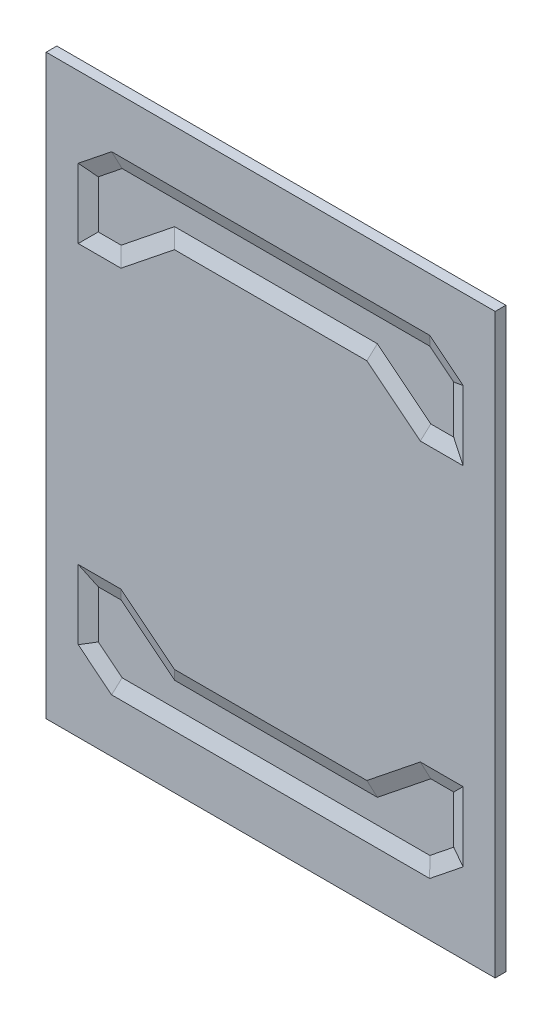
ISO-10303-21;
HEADER;
FILE_DESCRIPTION(('STEP AP214'),'2;1');
FILE_NAME('part.step','',(''),(''),'','','');
FILE_SCHEMA(('AUTOMOTIVE_DESIGN { 1 0 10303 214 1 1 1 1 }'));
ENDSEC;
DATA;
#1=APPLICATION_CONTEXT('core data for automotive mechanical design processes');
#2=APPLICATION_PROTOCOL_DEFINITION('international standard','automotive_design',2000,#1);
#3=PRODUCT_CONTEXT('',#1,'mechanical');
#4=PRODUCT('Part','Part','',(#3));
#5=PRODUCT_RELATED_PRODUCT_CATEGORY('part','',(#4));
#6=PRODUCT_DEFINITION_FORMATION('','',#4);
#7=PRODUCT_DEFINITION_CONTEXT('part definition',#1,'design');
#8=PRODUCT_DEFINITION('design','',#6,#7);
#9=PRODUCT_DEFINITION_SHAPE('','',#8);
#10=(LENGTH_UNIT() NAMED_UNIT(*) SI_UNIT(.MILLI.,.METRE.));
#11=(NAMED_UNIT(*) PLANE_ANGLE_UNIT() SI_UNIT($,.RADIAN.));
#12=(NAMED_UNIT(*) SI_UNIT($,.STERADIAN.) SOLID_ANGLE_UNIT());
#13=UNCERTAINTY_MEASURE_WITH_UNIT(LENGTH_MEASURE(1.E-05),#10,'distance_accuracy_value','');
#14=(GEOMETRIC_REPRESENTATION_CONTEXT(3) GLOBAL_UNCERTAINTY_ASSIGNED_CONTEXT((#13)) GLOBAL_UNIT_ASSIGNED_CONTEXT((#10,
#11,#12)) REPRESENTATION_CONTEXT('',''));
#15=CARTESIAN_POINT('',(0.,0.,0.));
#16=DIRECTION('',(0.,0.,1.));
#17=DIRECTION('',(1.,0.,0.));
#18=AXIS2_PLACEMENT_3D('',#15,#16,#17);
#19=CARTESIAN_POINT('',(0.,0.,10.));
#20=DIRECTION('',(1.,0.,0.));
#21=DIRECTION('',(0.,0.,-1.));
#22=AXIS2_PLACEMENT_3D('',#19,#20,#21);
#23=PLANE('',#22);
#24=DIRECTION('',(0.,-1.,0.));
#25=VECTOR('',#24,1.);
#26=CARTESIAN_POINT('',(0.,0.,0.));
#27=LINE('',#26,#25);
#28=CARTESIAN_POINT('',(0.,540.,0.));
#29=VERTEX_POINT('',#28);
#30=CARTESIAN_POINT('',(0.,0.,0.));
#31=VERTEX_POINT('',#30);
#32=EDGE_CURVE('E274',#29,#31,#27,.T.);
#33=ORIENTED_EDGE('',*,*,#32,.T.);
#34=DIRECTION('',(0.,0.,-1.));
#35=VECTOR('',#34,1.);
#36=CARTESIAN_POINT('',(0.,0.,10.));
#37=LINE('',#36,#35);
#38=CARTESIAN_POINT('',(0.,0.,10.));
#39=VERTEX_POINT('',#38);
#40=EDGE_CURVE('E301',#39,#31,#37,.T.);
#41=ORIENTED_EDGE('',*,*,#40,.F.);
#42=DIRECTION('',(0.,-1.,0.));
#43=VECTOR('',#42,1.);
#44=CARTESIAN_POINT('',(0.,0.,10.));
#45=LINE('',#44,#43);
#46=CARTESIAN_POINT('',(0.,540.,10.));
#47=VERTEX_POINT('',#46);
#48=EDGE_CURVE('E275',#47,#39,#45,.T.);
#49=ORIENTED_EDGE('',*,*,#48,.F.);
#50=DIRECTION('',(0.,0.,-1.));
#51=VECTOR('',#50,1.);
#52=CARTESIAN_POINT('',(0.,540.,10.));
#53=LINE('',#52,#51);
#54=EDGE_CURVE('E285',#47,#29,#53,.T.);
#55=ORIENTED_EDGE('',*,*,#54,.T.);
#56=EDGE_LOOP('',(#33,#41,#49,#55));
#57=FACE_BOUND('',#56,.T.);
#58=ADVANCED_FACE('F33',(#57),#23,.F.);
#59=CARTESIAN_POINT('',(0.,0.,10.));
#60=DIRECTION('',(0.,1.,0.));
#61=DIRECTION('',(0.,0.,1.));
#62=AXIS2_PLACEMENT_3D('',#59,#60,#61);
#63=PLANE('',#62);
#64=DIRECTION('',(1.,0.,0.));
#65=VECTOR('',#64,1.);
#66=CARTESIAN_POINT('',(0.,0.,0.));
#67=LINE('',#66,#65);
#68=CARTESIAN_POINT('',(420.,0.,0.));
#69=VERTEX_POINT('',#68);
#70=EDGE_CURVE('E288',#31,#69,#67,.T.);
#71=ORIENTED_EDGE('',*,*,#70,.T.);
#72=DIRECTION('',(0.,0.,-1.));
#73=VECTOR('',#72,1.);
#74=CARTESIAN_POINT('',(420.,0.,10.));
#75=LINE('',#74,#73);
#76=CARTESIAN_POINT('',(420.,0.,10.));
#77=VERTEX_POINT('',#76);
#78=EDGE_CURVE('E298',#77,#69,#75,.T.);
#79=ORIENTED_EDGE('',*,*,#78,.F.);
#80=DIRECTION('',(1.,0.,0.));
#81=VECTOR('',#80,1.);
#82=CARTESIAN_POINT('',(0.,0.,10.));
#83=LINE('',#82,#81);
#84=EDGE_CURVE('E278',#39,#77,#83,.T.);
#85=ORIENTED_EDGE('',*,*,#84,.F.);
#86=ORIENTED_EDGE('',*,*,#40,.T.);
#87=EDGE_LOOP('',(#71,#79,#85,#86));
#88=FACE_BOUND('',#87,.T.);
#89=ADVANCED_FACE('F429',(#88),#63,.F.);
#90=CARTESIAN_POINT('',(420.,0.,10.));
#91=DIRECTION('',(-1.,0.,0.));
#92=DIRECTION('',(0.,0.,1.));
#93=AXIS2_PLACEMENT_3D('',#90,#91,#92);
#94=PLANE('',#93);
#95=DIRECTION('',(0.,1.,0.));
#96=VECTOR('',#95,1.);
#97=CARTESIAN_POINT('',(420.,0.,0.));
#98=LINE('',#97,#96);
#99=CARTESIAN_POINT('',(420.,540.,0.));
#100=VERTEX_POINT('',#99);
#101=EDGE_CURVE('E290',#69,#100,#98,.T.);
#102=ORIENTED_EDGE('',*,*,#101,.T.);
#103=DIRECTION('',(0.,0.,-1.));
#104=VECTOR('',#103,1.);
#105=CARTESIAN_POINT('',(420.,540.,10.));
#106=LINE('',#105,#104);
#107=CARTESIAN_POINT('',(420.,540.,10.));
#108=VERTEX_POINT('',#107);
#109=EDGE_CURVE('E295',#108,#100,#106,.T.);
#110=ORIENTED_EDGE('',*,*,#109,.F.);
#111=DIRECTION('',(0.,1.,0.));
#112=VECTOR('',#111,1.);
#113=CARTESIAN_POINT('',(420.,0.,10.));
#114=LINE('',#113,#112);
#115=EDGE_CURVE('E281',#77,#108,#114,.T.);
#116=ORIENTED_EDGE('',*,*,#115,.F.);
#117=ORIENTED_EDGE('',*,*,#78,.T.);
#118=EDGE_LOOP('',(#102,#110,#116,#117));
#119=FACE_BOUND('',#118,.T.);
#120=ADVANCED_FACE('F435',(#119),#94,.F.);
#121=CARTESIAN_POINT('',(0.,540.,10.));
#122=DIRECTION('',(0.,-1.,0.));
#123=DIRECTION('',(0.,0.,-1.));
#124=AXIS2_PLACEMENT_3D('',#121,#122,#123);
#125=PLANE('',#124);
#126=DIRECTION('',(-1.,0.,0.));
#127=VECTOR('',#126,1.);
#128=CARTESIAN_POINT('',(0.,540.,0.));
#129=LINE('',#128,#127);
#130=EDGE_CURVE('E279',#100,#29,#129,.T.);
#131=ORIENTED_EDGE('',*,*,#130,.T.);
#132=ORIENTED_EDGE('',*,*,#54,.F.);
#133=DIRECTION('',(-1.,0.,0.));
#134=VECTOR('',#133,1.);
#135=CARTESIAN_POINT('',(0.,540.,10.));
#136=LINE('',#135,#134);
#137=EDGE_CURVE('E283',#108,#47,#136,.T.);
#138=ORIENTED_EDGE('',*,*,#137,.F.);
#139=ORIENTED_EDGE('',*,*,#109,.T.);
#140=EDGE_LOOP('',(#131,#132,#138,#139));
#141=FACE_BOUND('',#140,.T.);
#142=ADVANCED_FACE('F626',(#141),#125,.F.);
#143=CARTESIAN_POINT('',(0.,0.,10.));
#144=DIRECTION('',(0.,0.,-1.));
#145=DIRECTION('',(-1.,0.,0.));
#146=AXIS2_PLACEMENT_3D('',#143,#144,#145);
#147=PLANE('',#146);
#148=DIRECTION('',(1.,0.,0.));
#149=VECTOR('',#148,1.);
#150=CARTESIAN_POINT('',(70.0000000000038,400.,10.));
#151=LINE('',#150,#149);
#152=CARTESIAN_POINT('',(30.0000000000038,400.,10.));
#153=VERTEX_POINT('',#152);
#154=CARTESIAN_POINT('',(70.0000000000038,400.,10.));
#155=VERTEX_POINT('',#154);
#156=EDGE_CURVE('E198',#153,#155,#151,.T.);
#157=ORIENTED_EDGE('',*,*,#156,.F.);
#158=DIRECTION('',(0.,-1.,0.));
#159=VECTOR('',#158,1.);
#160=CARTESIAN_POINT('',(30.0000000000038,400.,10.));
#161=LINE('',#160,#159);
#162=CARTESIAN_POINT('',(30.0000000000038,465.,10.));
#163=VERTEX_POINT('',#162);
#164=EDGE_CURVE('E220',#163,#153,#161,.T.);
#165=ORIENTED_EDGE('',*,*,#164,.F.);
#166=DIRECTION('',(-0.78086880944303,-0.624695047554424,0.));
#167=VECTOR('',#166,1.);
#168=CARTESIAN_POINT('',(30.0000000000038,465.,10.));
#169=LINE('',#168,#167);
#170=CARTESIAN_POINT('',(61.2500000000038,490.,10.));
#171=VERTEX_POINT('',#170);
#172=EDGE_CURVE('E241',#171,#163,#169,.T.);
#173=ORIENTED_EDGE('',*,*,#172,.F.);
#174=DIRECTION('',(-1.,0.,0.));
#175=VECTOR('',#174,1.);
#176=CARTESIAN_POINT('',(61.2500000000038,490.,10.));
#177=LINE('',#176,#175);
#178=CARTESIAN_POINT('',(358.750000000004,490.,10.));
#179=VERTEX_POINT('',#178);
#180=EDGE_CURVE('E238',#179,#171,#177,.T.);
#181=ORIENTED_EDGE('',*,*,#180,.F.);
#182=DIRECTION('',(-0.78086880944303,0.624695047554424,0.));
#183=VECTOR('',#182,1.);
#184=CARTESIAN_POINT('',(390.000000000004,465.,10.));
#185=LINE('',#184,#183);
#186=CARTESIAN_POINT('',(390.000000000004,465.,10.));
#187=VERTEX_POINT('',#186);
#188=EDGE_CURVE('E235',#187,#179,#185,.T.);
#189=ORIENTED_EDGE('',*,*,#188,.F.);
#190=DIRECTION('',(0.,1.,0.));
#191=VECTOR('',#190,1.);
#192=CARTESIAN_POINT('',(390.000000000004,400.,10.));
#193=LINE('',#192,#191);
#194=CARTESIAN_POINT('',(390.000000000004,400.,10.));
#195=VERTEX_POINT('',#194);
#196=EDGE_CURVE('E232',#195,#187,#193,.T.);
#197=ORIENTED_EDGE('',*,*,#196,.F.);
#198=DIRECTION('',(1.,0.,0.));
#199=VECTOR('',#198,1.);
#200=CARTESIAN_POINT('',(350.000000000004,400.,10.));
#201=LINE('',#200,#199);
#202=CARTESIAN_POINT('',(350.000000000004,400.,10.));
#203=VERTEX_POINT('',#202);
#204=EDGE_CURVE('E229',#203,#195,#201,.T.);
#205=ORIENTED_EDGE('',*,*,#204,.F.);
#206=DIRECTION('',(0.780868809443031,-0.624695047554423,0.));
#207=VECTOR('',#206,1.);
#208=CARTESIAN_POINT('',(300.000000000004,440.,10.));
#209=LINE('',#208,#207);
#210=CARTESIAN_POINT('',(300.000000000004,440.,10.));
#211=VERTEX_POINT('',#210);
#212=EDGE_CURVE('E226',#211,#203,#209,.T.);
#213=ORIENTED_EDGE('',*,*,#212,.F.);
#214=DIRECTION('',(1.,0.,0.));
#215=VECTOR('',#214,1.);
#216=CARTESIAN_POINT('',(300.000000000004,440.,10.));
#217=LINE('',#216,#215);
#218=CARTESIAN_POINT('',(120.000000000004,440.,10.));
#219=VERTEX_POINT('',#218);
#220=EDGE_CURVE('E201',#219,#211,#217,.T.);
#221=ORIENTED_EDGE('',*,*,#220,.F.);
#222=DIRECTION('',(0.780868809443031,0.624695047554423,0.));
#223=VECTOR('',#222,1.);
#224=CARTESIAN_POINT('',(120.000000000004,440.,10.));
#225=LINE('',#224,#223);
#226=EDGE_CURVE('E193',#155,#219,#225,.T.);
#227=ORIENTED_EDGE('',*,*,#226,.F.);
#228=EDGE_LOOP('',(#157,#165,#173,#181,#189,#197,#205,#213,#221,#227));
#229=FACE_BOUND('',#228,.T.);
#230=DIRECTION('',(-0.780868809443031,-0.624695047554423,0.));
#231=VECTOR('',#230,1.);
#232=CARTESIAN_POINT('',(300.000000000004,100.,10.));
#233=LINE('',#232,#231);
#234=CARTESIAN_POINT('',(350.000000000004,140.,10.));
#235=VERTEX_POINT('',#234);
#236=CARTESIAN_POINT('',(300.000000000004,100.,10.));
#237=VERTEX_POINT('',#236);
#238=EDGE_CURVE('E247',#235,#237,#233,.T.);
#239=ORIENTED_EDGE('',*,*,#238,.F.);
#240=DIRECTION('',(-1.,0.,0.));
#241=VECTOR('',#240,1.);
#242=CARTESIAN_POINT('',(350.000000000004,140.,10.));
#243=LINE('',#242,#241);
#244=CARTESIAN_POINT('',(390.000000000004,140.,10.));
#245=VERTEX_POINT('',#244);
#246=EDGE_CURVE('E244',#245,#235,#243,.T.);
#247=ORIENTED_EDGE('',*,*,#246,.F.);
#248=DIRECTION('',(0.,1.,0.));
#249=VECTOR('',#248,1.);
#250=CARTESIAN_POINT('',(390.000000000004,140.,10.));
#251=LINE('',#250,#249);
#252=CARTESIAN_POINT('',(390.000000000004,75.0000000000001,10.));
#253=VERTEX_POINT('',#252);
#254=EDGE_CURVE('E271',#253,#245,#251,.T.);
#255=ORIENTED_EDGE('',*,*,#254,.F.);
#256=DIRECTION('',(0.78086880944303,0.624695047554424,0.));
#257=VECTOR('',#256,1.);
#258=CARTESIAN_POINT('',(390.000000000004,75.0000000000001,10.));
#259=LINE('',#258,#257);
#260=CARTESIAN_POINT('',(358.750000000004,50.,10.));
#261=VERTEX_POINT('',#260);
#262=EDGE_CURVE('E268',#261,#253,#259,.T.);
#263=ORIENTED_EDGE('',*,*,#262,.F.);
#264=DIRECTION('',(1.,0.,0.));
#265=VECTOR('',#264,1.);
#266=CARTESIAN_POINT('',(61.2500000000038,50.,10.));
#267=LINE('',#266,#265);
#268=CARTESIAN_POINT('',(61.2500000000038,50.,10.));
#269=VERTEX_POINT('',#268);
#270=EDGE_CURVE('E265',#269,#261,#267,.T.);
#271=ORIENTED_EDGE('',*,*,#270,.F.);
#272=DIRECTION('',(0.78086880944303,-0.624695047554424,0.));
#273=VECTOR('',#272,1.);
#274=CARTESIAN_POINT('',(30.0000000000038,75.0000000000001,10.));
#275=LINE('',#274,#273);
#276=CARTESIAN_POINT('',(30.0000000000038,75.0000000000001,10.));
#277=VERTEX_POINT('',#276);
#278=EDGE_CURVE('E262',#277,#269,#275,.T.);
#279=ORIENTED_EDGE('',*,*,#278,.F.);
#280=DIRECTION('',(0.,-1.,0.));
#281=VECTOR('',#280,1.);
#282=CARTESIAN_POINT('',(30.0000000000038,140.,10.));
#283=LINE('',#282,#281);
#284=CARTESIAN_POINT('',(30.0000000000038,140.,10.));
#285=VERTEX_POINT('',#284);
#286=EDGE_CURVE('E259',#285,#277,#283,.T.);
#287=ORIENTED_EDGE('',*,*,#286,.F.);
#288=DIRECTION('',(-1.,0.,0.));
#289=VECTOR('',#288,1.);
#290=CARTESIAN_POINT('',(70.0000000000038,140.,10.));
#291=LINE('',#290,#289);
#292=CARTESIAN_POINT('',(70.0000000000038,140.,10.));
#293=VERTEX_POINT('',#292);
#294=EDGE_CURVE('E256',#293,#285,#291,.T.);
#295=ORIENTED_EDGE('',*,*,#294,.F.);
#296=DIRECTION('',(-0.780868809443031,0.624695047554423,0.));
#297=VECTOR('',#296,1.);
#298=CARTESIAN_POINT('',(120.000000000004,100.,10.));
#299=LINE('',#298,#297);
#300=CARTESIAN_POINT('',(120.000000000004,100.,10.));
#301=VERTEX_POINT('',#300);
#302=EDGE_CURVE('E253',#301,#293,#299,.T.);
#303=ORIENTED_EDGE('',*,*,#302,.F.);
#304=DIRECTION('',(-1.,0.,0.));
#305=VECTOR('',#304,1.);
#306=CARTESIAN_POINT('',(300.000000000004,100.,10.));
#307=LINE('',#306,#305);
#308=EDGE_CURVE('E250',#237,#301,#307,.T.);
#309=ORIENTED_EDGE('',*,*,#308,.F.);
#310=EDGE_LOOP('',(#239,#247,#255,#263,#271,#279,#287,#295,#303,#309));
#311=FACE_BOUND('',#310,.T.);
#312=ORIENTED_EDGE('',*,*,#48,.T.);
#313=ORIENTED_EDGE('',*,*,#84,.T.);
#314=ORIENTED_EDGE('',*,*,#115,.T.);
#315=ORIENTED_EDGE('',*,*,#137,.T.);
#316=EDGE_LOOP('',(#312,#313,#314,#315));
#317=FACE_BOUND('',#316,.T.);
#318=ADVANCED_FACE('F195',(#229,#311,#317),#147,.F.);
#319=CARTESIAN_POINT('',(0.,0.,0.));
#320=DIRECTION('',(0.,0.,-1.));
#321=DIRECTION('',(-1.,0.,0.));
#322=AXIS2_PLACEMENT_3D('',#319,#320,#321);
#323=PLANE('',#322);
#324=ORIENTED_EDGE('',*,*,#32,.F.);
#325=ORIENTED_EDGE('',*,*,#130,.F.);
#326=ORIENTED_EDGE('',*,*,#101,.F.);
#327=ORIENTED_EDGE('',*,*,#70,.F.);
#328=EDGE_LOOP('',(#324,#325,#326,#327));
#329=FACE_BOUND('',#328,.T.);
#330=ADVANCED_FACE('F609',(#329),#323,.T.);
#331=CARTESIAN_POINT('',(0.,0.,5.));
#332=DIRECTION('',(0.,0.,-1.));
#333=DIRECTION('',(-1.,0.,0.));
#334=AXIS2_PLACEMENT_3D('',#331,#332,#333);
#335=PLANE('',#334);
#336=DIRECTION('',(0.780868809443031,0.624695047554424,0.));
#337=VECTOR('',#336,1.);
#338=CARTESIAN_POINT('',(381.418322313999,85.727097107506,5.));
#339=LINE('',#338,#337);
#340=CARTESIAN_POINT('',(353.931184801208,63.7373870972735,5.));
#341=VERTEX_POINT('',#340);
#342=CARTESIAN_POINT('',(376.26261290273,81.6025295784911,5.));
#343=VERTEX_POINT('',#342);
#344=EDGE_CURVE('E42',#341,#343,#339,.T.);
#345=ORIENTED_EDGE('',*,*,#344,.T.);
#346=DIRECTION('',(0.,1.,0.));
#347=VECTOR('',#346,1.);
#348=CARTESIAN_POINT('',(376.26261290273,140.,5.));
#349=LINE('',#348,#347);
#350=CARTESIAN_POINT('',(376.26261290273,126.262612902727,5.));
#351=VERTEX_POINT('',#350);
#352=EDGE_CURVE('E11',#343,#351,#349,.T.);
#353=ORIENTED_EDGE('',*,*,#352,.T.);
#354=DIRECTION('',(-1.,0.,0.));
#355=VECTOR('',#354,1.);
#356=CARTESIAN_POINT('',(350.000000000004,126.262612902727,5.));
#357=LINE('',#356,#355);
#358=CARTESIAN_POINT('',(354.818815198799,126.262612902727,5.));
#359=VERTEX_POINT('',#358);
#360=EDGE_CURVE('E324',#351,#359,#357,.T.);
#361=ORIENTED_EDGE('',*,*,#360,.T.);
#362=DIRECTION('',(-0.780868809443031,-0.624695047554423,0.));
#363=VECTOR('',#362,1.);
#364=CARTESIAN_POINT('',(308.581677686008,89.2729028924941,5.));
#365=LINE('',#364,#363);
#366=CARTESIAN_POINT('',(304.818815198799,86.2626129027266,5.));
#367=VERTEX_POINT('',#366);
#368=EDGE_CURVE('E326',#359,#367,#365,.T.);
#369=ORIENTED_EDGE('',*,*,#368,.T.);
#370=DIRECTION('',(-1.,0.,0.));
#371=VECTOR('',#370,1.);
#372=CARTESIAN_POINT('',(120.000000000004,86.2626129027266,5.));
#373=LINE('',#372,#371);
#374=CARTESIAN_POINT('',(115.181184801208,86.2626129027266,5.));
#375=VERTEX_POINT('',#374);
#376=EDGE_CURVE('E328',#367,#375,#373,.T.);
#377=ORIENTED_EDGE('',*,*,#376,.T.);
#378=DIRECTION('',(-0.780868809443031,0.624695047554423,0.));
#379=VECTOR('',#378,1.);
#380=CARTESIAN_POINT('',(61.418322313999,129.272902892494,5.));
#381=LINE('',#380,#379);
#382=CARTESIAN_POINT('',(65.1811848012084,126.262612902727,5.));
#383=VERTEX_POINT('',#382);
#384=EDGE_CURVE('E330',#375,#383,#381,.T.);
#385=ORIENTED_EDGE('',*,*,#384,.T.);
#386=DIRECTION('',(-1.,0.,0.));
#387=VECTOR('',#386,1.);
#388=CARTESIAN_POINT('',(30.0000000000038,126.262612902727,5.));
#389=LINE('',#388,#387);
#390=CARTESIAN_POINT('',(43.7373870972772,126.262612902727,5.));
#391=VERTEX_POINT('',#390);
#392=EDGE_CURVE('E332',#383,#391,#389,.T.);
#393=ORIENTED_EDGE('',*,*,#392,.T.);
#394=DIRECTION('',(0.,-1.,0.));
#395=VECTOR('',#394,1.);
#396=CARTESIAN_POINT('',(43.7373870972772,75.0000000000001,5.));
#397=LINE('',#396,#395);
#398=CARTESIAN_POINT('',(43.7373870972772,81.6025295784911,5.));
#399=VERTEX_POINT('',#398);
#400=EDGE_CURVE('E334',#391,#399,#397,.T.);
#401=ORIENTED_EDGE('',*,*,#400,.T.);
#402=DIRECTION('',(0.78086880944303,-0.624695047554424,0.));
#403=VECTOR('',#402,1.);
#404=CARTESIAN_POINT('',(69.8316776860086,60.727097107506,5.));
#405=LINE('',#404,#403);
#406=CARTESIAN_POINT('',(66.0688151987992,63.7373870972735,5.));
#407=VERTEX_POINT('',#406);
#408=EDGE_CURVE('E336',#399,#407,#405,.T.);
#409=ORIENTED_EDGE('',*,*,#408,.T.);
#410=DIRECTION('',(1.,0.,0.));
#411=VECTOR('',#410,1.);
#412=CARTESIAN_POINT('',(358.750000000004,63.7373870972735,5.));
#413=LINE('',#412,#411);
#414=EDGE_CURVE('E53',#407,#341,#413,.T.);
#415=ORIENTED_EDGE('',*,*,#414,.T.);
#416=EDGE_LOOP('',(#345,#353,#361,#369,#377,#385,#393,#401,#409,#415));
#417=FACE_BOUND('',#416,.T.);
#418=ADVANCED_FACE('F409',(#417),#335,.F.);
#419=CARTESIAN_POINT('',(0.,0.,5.));
#420=DIRECTION('',(0.,0.,-1.));
#421=DIRECTION('',(-1.,0.,0.));
#422=AXIS2_PLACEMENT_3D('',#419,#420,#421);
#423=PLANE('',#422);
#424=DIRECTION('',(-1.,0.,0.));
#425=VECTOR('',#424,1.);
#426=CARTESIAN_POINT('',(61.2500000000038,476.262612902727,5.));
#427=LINE('',#426,#425);
#428=CARTESIAN_POINT('',(353.931184801208,476.262612902727,5.));
#429=VERTEX_POINT('',#428);
#430=CARTESIAN_POINT('',(66.0688151987991,476.262612902727,5.));
#431=VERTEX_POINT('',#430);
#432=EDGE_CURVE('E319',#429,#431,#427,.T.);
#433=ORIENTED_EDGE('',*,*,#432,.T.);
#434=DIRECTION('',(-0.78086880944303,-0.624695047554424,0.));
#435=VECTOR('',#434,1.);
#436=CARTESIAN_POINT('',(38.5816776860085,454.272902892494,5.));
#437=LINE('',#436,#435);
#438=CARTESIAN_POINT('',(43.7373870972771,458.397470421509,5.));
#439=VERTEX_POINT('',#438);
#440=EDGE_CURVE('E321',#431,#439,#437,.T.);
#441=ORIENTED_EDGE('',*,*,#440,.T.);
#442=DIRECTION('',(0.,-1.,0.));
#443=VECTOR('',#442,1.);
#444=CARTESIAN_POINT('',(43.7373870972771,400.,5.));
#445=LINE('',#444,#443);
#446=CARTESIAN_POINT('',(43.7373870972771,413.737387097273,5.));
#447=VERTEX_POINT('',#446);
#448=EDGE_CURVE('E304',#439,#447,#445,.T.);
#449=ORIENTED_EDGE('',*,*,#448,.T.);
#450=DIRECTION('',(1.,0.,0.));
#451=VECTOR('',#450,1.);
#452=CARTESIAN_POINT('',(70.0000000000038,413.737387097273,5.));
#453=LINE('',#452,#451);
#454=CARTESIAN_POINT('',(65.1811848012083,413.737387097273,5.));
#455=VERTEX_POINT('',#454);
#456=EDGE_CURVE('E306',#447,#455,#453,.T.);
#457=ORIENTED_EDGE('',*,*,#456,.T.);
#458=DIRECTION('',(0.780868809443031,0.624695047554423,0.));
#459=VECTOR('',#458,1.);
#460=CARTESIAN_POINT('',(111.418322313999,450.727097107506,5.));
#461=LINE('',#460,#459);
#462=CARTESIAN_POINT('',(115.181184801208,453.737387097273,5.));
#463=VERTEX_POINT('',#462);
#464=EDGE_CURVE('E210',#455,#463,#461,.T.);
#465=ORIENTED_EDGE('',*,*,#464,.T.);
#466=DIRECTION('',(1.,0.,0.));
#467=VECTOR('',#466,1.);
#468=CARTESIAN_POINT('',(300.000000000004,453.737387097273,5.));
#469=LINE('',#468,#467);
#470=CARTESIAN_POINT('',(304.818815198799,453.737387097273,5.));
#471=VERTEX_POINT('',#470);
#472=EDGE_CURVE('E309',#463,#471,#469,.T.);
#473=ORIENTED_EDGE('',*,*,#472,.T.);
#474=DIRECTION('',(0.780868809443031,-0.624695047554423,0.));
#475=VECTOR('',#474,1.);
#476=CARTESIAN_POINT('',(358.581677686008,410.727097107506,5.));
#477=LINE('',#476,#475);
#478=CARTESIAN_POINT('',(354.818815198799,413.737387097273,5.));
#479=VERTEX_POINT('',#478);
#480=EDGE_CURVE('E311',#471,#479,#477,.T.);
#481=ORIENTED_EDGE('',*,*,#480,.T.);
#482=DIRECTION('',(1.,0.,0.));
#483=VECTOR('',#482,1.);
#484=CARTESIAN_POINT('',(390.000000000004,413.737387097273,5.));
#485=LINE('',#484,#483);
#486=CARTESIAN_POINT('',(376.26261290273,413.737387097273,5.));
#487=VERTEX_POINT('',#486);
#488=EDGE_CURVE('E313',#479,#487,#485,.T.);
#489=ORIENTED_EDGE('',*,*,#488,.T.);
#490=DIRECTION('',(0.,1.,0.));
#491=VECTOR('',#490,1.);
#492=CARTESIAN_POINT('',(376.26261290273,465.,5.));
#493=LINE('',#492,#491);
#494=CARTESIAN_POINT('',(376.26261290273,458.397470421509,5.));
#495=VERTEX_POINT('',#494);
#496=EDGE_CURVE('E315',#487,#495,#493,.T.);
#497=ORIENTED_EDGE('',*,*,#496,.T.);
#498=DIRECTION('',(-0.780868809443031,0.624695047554424,0.));
#499=VECTOR('',#498,1.);
#500=CARTESIAN_POINT('',(350.168322313999,479.272902892494,5.));
#501=LINE('',#500,#499);
#502=EDGE_CURVE('E317',#495,#429,#501,.T.);
#503=ORIENTED_EDGE('',*,*,#502,.T.);
#504=EDGE_LOOP('',(#433,#441,#449,#457,#465,#473,#481,#489,#497,#503));
#505=FACE_BOUND('',#504,.T.);
#506=ADVANCED_FACE('F475',(#505),#423,.F.);
#507=CARTESIAN_POINT('',(340.288994759176,425.361243448972,5.));
#508=DIRECTION('',(0.213658289699396,0.267072862124246,0.93969262078591));
#509=DIRECTION('',(-0.780868809443031,0.624695047554423,0.));
#510=AXIS2_PLACEMENT_3D('',#507,#508,#509);
#511=PLANE('',#510);
#512=DIRECTION('',(0.313057437902422,0.892458214463441,-0.32482822539105));
#513=VECTOR('',#512,1.);
#514=CARTESIAN_POINT('',(274.945059582951,368.573850415716,35.9969923969243));
#515=LINE('',#514,#513);
#516=EDGE_CURVE('E354',#211,#471,#515,.T.);
#517=ORIENTED_EDGE('',*,*,#516,.F.);
#518=ORIENTED_EDGE('',*,*,#212,.T.);
#519=DIRECTION('',(0.313057437902422,0.892458214463441,-0.32482822539105));
#520=VECTOR('',#519,1.);
#521=CARTESIAN_POINT('',(320.044811611649,314.604316312971,41.0814869968899));
#522=LINE('',#521,#520);
#523=EDGE_CURVE('E222',#479,#203,#522,.F.);
#524=ORIENTED_EDGE('',*,*,#523,.F.);
#525=ORIENTED_EDGE('',*,*,#480,.F.);
#526=EDGE_LOOP('',(#517,#518,#524,#525));
#527=FACE_BOUND('',#526,.T.);
#528=ADVANCED_FACE('F471',(#527),#511,.T.);
#529=CARTESIAN_POINT('',(0.,413.737387097273,5.));
#530=DIRECTION('',(0.,0.342020143325664,0.93969262078591));
#531=DIRECTION('',(-1.,0.,0.));
#532=AXIS2_PLACEMENT_3D('',#529,#530,#531);
#533=PLANE('',#532);
#534=ORIENTED_EDGE('',*,*,#523,.T.);
#535=ORIENTED_EDGE('',*,*,#204,.T.);
#536=DIRECTION('',(-0.684791078771737,0.684791078771737,-0.24924356936395));
#537=VECTOR('',#536,1.);
#538=CARTESIAN_POINT('',(570.280135645657,219.719864354347,75.6166032044899));
#539=LINE('',#538,#537);
#540=EDGE_CURVE('E351',#487,#195,#539,.F.);
#541=ORIENTED_EDGE('',*,*,#540,.F.);
#542=ORIENTED_EDGE('',*,*,#488,.F.);
#543=EDGE_LOOP('',(#534,#535,#541,#542));
#544=FACE_BOUND('',#543,.T.);
#545=ADVANCED_FACE('F467',(#544),#533,.T.);
#546=CARTESIAN_POINT('',(0.,453.737387097273,5.));
#547=DIRECTION('',(0.,0.342020143325664,0.93969262078591));
#548=DIRECTION('',(-1.,0.,0.));
#549=AXIS2_PLACEMENT_3D('',#546,#547,#548);
#550=PLANE('',#549);
#551=ORIENTED_EDGE('',*,*,#516,.T.);
#552=ORIENTED_EDGE('',*,*,#472,.F.);
#553=DIRECTION('',(-0.313057437902432,0.892458214463438,-0.324828225391049));
#554=VECTOR('',#553,1.);
#555=CARTESIAN_POINT('',(151.775148134884,349.416009538785,42.9698762289352));
#556=LINE('',#555,#554);
#557=EDGE_CURVE('E349',#219,#463,#556,.T.);
#558=ORIENTED_EDGE('',*,*,#557,.F.);
#559=ORIENTED_EDGE('',*,*,#220,.T.);
#560=EDGE_LOOP('',(#551,#552,#558,#559));
#561=FACE_BOUND('',#560,.T.);
#562=ADVANCED_FACE('F463',(#561),#550,.T.);
#563=CARTESIAN_POINT('',(376.26261290273,0.,5.));
#564=DIRECTION('',(-0.342020143325664,0.,0.93969262078591));
#565=DIRECTION('',(0.,-1.,0.));
#566=AXIS2_PLACEMENT_3D('',#563,#564,#565);
#567=PLANE('',#566);
#568=ORIENTED_EDGE('',*,*,#540,.T.);
#569=ORIENTED_EDGE('',*,*,#196,.T.);
#570=DIRECTION('',(-0.856399643710187,-0.411606948145765,-0.311703978946684));
#571=VECTOR('',#570,1.);
#572=CARTESIAN_POINT('',(373.635391657227,457.134762611076,4.04376966780512));
#573=LINE('',#572,#571);
#574=EDGE_CURVE('E213',#495,#187,#573,.F.);
#575=ORIENTED_EDGE('',*,*,#574,.F.);
#576=ORIENTED_EDGE('',*,*,#496,.F.);
#577=EDGE_LOOP('',(#568,#569,#575,#576));
#578=FACE_BOUND('',#577,.T.);
#579=ADVANCED_FACE('F460',(#578),#567,.T.);
#580=CARTESIAN_POINT('',(-176.386555734784,220.48319466848,5.));
#581=DIRECTION('',(-0.213658289699395,0.267072862124245,0.939692620785911));
#582=DIRECTION('',(-0.780868809443031,-0.624695047554423,0.));
#583=AXIS2_PLACEMENT_3D('',#580,#581,#582);
#584=PLANE('',#583);
#585=ORIENTED_EDGE('',*,*,#557,.T.);
#586=ORIENTED_EDGE('',*,*,#464,.F.);
#587=DIRECTION('',(-0.313057437902432,0.892458214463438,-0.324828225391049));
#588=VECTOR('',#587,1.);
#589=CARTESIAN_POINT('',(95.4997688239894,327.305742018571,36.4585461073081));
#590=LINE('',#589,#588);
#591=EDGE_CURVE('E208',#155,#455,#590,.T.);
#592=ORIENTED_EDGE('',*,*,#591,.F.);
#593=ORIENTED_EDGE('',*,*,#226,.T.);
#594=EDGE_LOOP('',(#585,#586,#592,#593));
#595=FACE_BOUND('',#594,.T.);
#596=ADVANCED_FACE('F209',(#595),#584,.T.);
#597=CARTESIAN_POINT('',(370.442712557899,463.053390697374,5.));
#598=DIRECTION('',(-0.213658289699396,-0.267072862124245,0.93969262078591));
#599=DIRECTION('',(0.780868809443031,-0.624695047554424,0.));
#600=AXIS2_PLACEMENT_3D('',#597,#598,#599);
#601=PLANE('',#600);
#602=ORIENTED_EDGE('',*,*,#574,.T.);
#603=ORIENTED_EDGE('',*,*,#188,.T.);
#604=DIRECTION('',(-0.313057437902429,-0.892458214463438,-0.324828225391049));
#605=VECTOR('',#604,1.);
#606=CARTESIAN_POINT('',(319.244173395158,377.377537780618,-30.9912239576243));
#607=LINE('',#606,#605);
#608=EDGE_CURVE('E214',#429,#179,#607,.F.);
#609=ORIENTED_EDGE('',*,*,#608,.F.);
#610=ORIENTED_EDGE('',*,*,#502,.F.);
#611=EDGE_LOOP('',(#602,#603,#609,#610));
#612=FACE_BOUND('',#611,.T.);
#613=ADVANCED_FACE('F454',(#612),#601,.T.);
#614=CARTESIAN_POINT('',(0.,413.737387097273,5.));
#615=DIRECTION('',(0.,0.342020143325664,0.93969262078591));
#616=DIRECTION('',(-1.,0.,0.));
#617=AXIS2_PLACEMENT_3D('',#614,#615,#616);
#618=PLANE('',#617);
#619=ORIENTED_EDGE('',*,*,#591,.T.);
#620=ORIENTED_EDGE('',*,*,#456,.F.);
#621=DIRECTION('',(0.684791078771737,0.684791078771736,-0.24924356936395));
#622=VECTOR('',#621,1.);
#623=CARTESIAN_POINT('',(23.227228333532,393.227228333528,12.4650872900772));
#624=LINE('',#623,#622);
#625=EDGE_CURVE('E218',#153,#447,#624,.T.);
#626=ORIENTED_EDGE('',*,*,#625,.F.);
#627=ORIENTED_EDGE('',*,*,#156,.T.);
#628=EDGE_LOOP('',(#619,#620,#626,#627));
#629=FACE_BOUND('',#628,.T.);
#630=ADVANCED_FACE('F216',(#629),#618,.T.);
#631=CARTESIAN_POINT('',(0.,476.262612902727,5.));
#632=DIRECTION('',(0.,-0.342020143325664,0.93969262078591));
#633=DIRECTION('',(1.,0.,0.));
#634=AXIS2_PLACEMENT_3D('',#631,#632,#633);
#635=PLANE('',#634);
#636=ORIENTED_EDGE('',*,*,#608,.T.);
#637=ORIENTED_EDGE('',*,*,#180,.T.);
#638=DIRECTION('',(0.313057437902424,-0.89245821446344,-0.32482822539105));
#639=VECTOR('',#638,1.);
#640=CARTESIAN_POINT('',(100.283323906649,378.724539523143,-30.5009554178406));
#641=LINE('',#640,#639);
#642=EDGE_CURVE('E342',#431,#171,#641,.F.);
#643=ORIENTED_EDGE('',*,*,#642,.F.);
#644=ORIENTED_EDGE('',*,*,#432,.F.);
#645=EDGE_LOOP('',(#636,#637,#643,#644));
#646=FACE_BOUND('',#645,.T.);
#647=ADVANCED_FACE('F447',(#646),#635,.T.);
#648=CARTESIAN_POINT('',(43.7373870972771,0.,5.));
#649=DIRECTION('',(0.342020143325664,0.,0.93969262078591));
#650=DIRECTION('',(0.,1.,0.));
#651=AXIS2_PLACEMENT_3D('',#648,#649,#650);
#652=PLANE('',#651);
#653=ORIENTED_EDGE('',*,*,#625,.T.);
#654=ORIENTED_EDGE('',*,*,#448,.F.);
#655=DIRECTION('',(-0.856399643710188,0.411606948145761,0.311703978946684));
#656=VECTOR('',#655,1.);
#657=CARTESIAN_POINT('',(-69.2430332406666,512.698667715402,46.1215100578947));
#658=LINE('',#657,#656);
#659=EDGE_CURVE('E340',#163,#439,#658,.F.);
#660=ORIENTED_EDGE('',*,*,#659,.F.);
#661=ORIENTED_EDGE('',*,*,#164,.T.);
#662=EDGE_LOOP('',(#653,#654,#660,#661));
#663=FACE_BOUND('',#662,.T.);
#664=ADVANCED_FACE('F443',(#663),#652,.T.);
#665=CARTESIAN_POINT('',(-206.540273533506,258.175341916882,5.));
#666=DIRECTION('',(0.213658289699397,-0.267072862124246,0.93969262078591));
#667=DIRECTION('',(0.78086880944303,0.624695047554424,0.));
#668=AXIS2_PLACEMENT_3D('',#665,#666,#667);
#669=PLANE('',#668);
#670=ORIENTED_EDGE('',*,*,#642,.T.);
#671=ORIENTED_EDGE('',*,*,#172,.T.);
#672=ORIENTED_EDGE('',*,*,#659,.T.);
#673=ORIENTED_EDGE('',*,*,#440,.F.);
#674=EDGE_LOOP('',(#670,#671,#672,#673));
#675=FACE_BOUND('',#674,.T.);
#676=ADVANCED_FACE('F440',(#675),#669,.T.);
#677=CARTESIAN_POINT('',(0.,126.262612902727,5.));
#678=DIRECTION('',(0.,-0.342020143325663,0.93969262078591));
#679=DIRECTION('',(1.,0.,0.));
#680=AXIS2_PLACEMENT_3D('',#677,#678,#679);
#681=PLANE('',#680);
#682=DIRECTION('',(-0.313057437902421,-0.892458214463441,-0.324828225391049));
#683=VECTOR('',#682,1.);
#684=CARTESIAN_POINT('',(58.7931054294255,108.051597223971,-1.62826764282209));
#685=LINE('',#684,#683);
#686=EDGE_CURVE('E380',#293,#383,#685,.T.);
#687=ORIENTED_EDGE('',*,*,#686,.F.);
#688=ORIENTED_EDGE('',*,*,#294,.T.);
#689=DIRECTION('',(0.684791078771737,-0.684791078771737,-0.24924356936395));
#690=VECTOR('',#689,1.);
#691=CARTESIAN_POINT('',(102.946827999645,67.0531720003589,-16.5504740760052));
#692=LINE('',#691,#690);
#693=EDGE_CURVE('E37',#391,#285,#692,.F.);
#694=ORIENTED_EDGE('',*,*,#693,.F.);
#695=ORIENTED_EDGE('',*,*,#392,.F.);
#696=EDGE_LOOP('',(#687,#688,#694,#695));
#697=FACE_BOUND('',#696,.T.);
#698=ADVANCED_FACE('F35',(#697),#681,.T.);
#699=CARTESIAN_POINT('',(43.7373870972772,0.,5.));
#700=DIRECTION('',(0.342020143325663,0.,0.939692620785911));
#701=DIRECTION('',(0.,1.,0.));
#702=AXIS2_PLACEMENT_3D('',#699,#700,#701);
#703=PLANE('',#702);
#704=ORIENTED_EDGE('',*,*,#693,.T.);
#705=ORIENTED_EDGE('',*,*,#286,.T.);
#706=DIRECTION('',(0.856399643710189,0.411606948145761,-0.311703978946684));
#707=VECTOR('',#706,1.);
#708=CARTESIAN_POINT('',(49.6676838165908,84.4527775347613,2.84154851380338));
#709=LINE('',#708,#707);
#710=EDGE_CURVE('E378',#399,#277,#709,.F.);
#711=ORIENTED_EDGE('',*,*,#710,.F.);
#712=ORIENTED_EDGE('',*,*,#400,.F.);
#713=EDGE_LOOP('',(#704,#705,#711,#712));
#714=FACE_BOUND('',#713,.T.);
#715=ADVANCED_FACE('F389',(#714),#703,.T.);
#716=CARTESIAN_POINT('',(87.0280784115576,108.785098014447,5.));
#717=DIRECTION('',(-0.213658289699396,-0.267072862124246,0.93969262078591));
#718=DIRECTION('',(0.780868809443031,-0.624695047554423,0.));
#719=AXIS2_PLACEMENT_3D('',#716,#717,#718);
#720=PLANE('',#719);
#721=ORIENTED_EDGE('',*,*,#686,.T.);
#722=ORIENTED_EDGE('',*,*,#384,.F.);
#723=DIRECTION('',(-0.313057437902421,-0.892458214463441,-0.324828225391049));
#724=VECTOR('',#723,1.);
#725=CARTESIAN_POINT('',(103.892857458124,54.0820631212262,-6.71276224278769));
#726=LINE('',#725,#724);
#727=EDGE_CURVE('E375',#301,#375,#726,.T.);
#728=ORIENTED_EDGE('',*,*,#727,.F.);
#729=ORIENTED_EDGE('',*,*,#302,.T.);
#730=EDGE_LOOP('',(#721,#722,#728,#729));
#731=FACE_BOUND('',#730,.T.);
#732=ADVANCED_FACE('F420',(#731),#720,.T.);
#733=CARTESIAN_POINT('',(56.8743606128356,71.0929507660444,5.));
#734=DIRECTION('',(0.213658289699396,0.267072862124245,0.93969262078591));
#735=DIRECTION('',(-0.78086880944303,0.624695047554424,0.));
#736=AXIS2_PLACEMENT_3D('',#733,#734,#735);
#737=PLANE('',#736);
#738=ORIENTED_EDGE('',*,*,#710,.T.);
#739=ORIENTED_EDGE('',*,*,#278,.T.);
#740=DIRECTION('',(0.313057437902423,0.89245821446344,-0.324828225391049));
#741=VECTOR('',#740,1.);
#742=CARTESIAN_POINT('',(59.593743645915,45.2783757563221,11.7185306820884));
#743=LINE('',#742,#741);
#744=EDGE_CURVE('E372',#407,#269,#743,.F.);
#745=ORIENTED_EDGE('',*,*,#744,.F.);
#746=ORIENTED_EDGE('',*,*,#408,.F.);
#747=EDGE_LOOP('',(#738,#739,#745,#746));
#748=FACE_BOUND('',#747,.T.);
#749=ADVANCED_FACE('F397',(#748),#737,.T.);
#750=CARTESIAN_POINT('',(0.,86.2626129027266,5.));
#751=DIRECTION('',(0.,-0.342020143325663,0.93969262078591));
#752=DIRECTION('',(1.,0.,0.));
#753=AXIS2_PLACEMENT_3D('',#750,#751,#752);
#754=PLANE('',#753);
#755=ORIENTED_EDGE('',*,*,#727,.T.);
#756=ORIENTED_EDGE('',*,*,#376,.F.);
#757=DIRECTION('',(0.313057437902423,-0.89245821446344,-0.324828225391049));
#758=VECTOR('',#757,1.);
#759=CARTESIAN_POINT('',(333.427573485636,4.70530664685409,-24.6844318640698));
#760=LINE('',#759,#758);
#761=EDGE_CURVE('E369',#237,#367,#760,.T.);
#762=ORIENTED_EDGE('',*,*,#761,.F.);
#763=ORIENTED_EDGE('',*,*,#308,.T.);
#764=EDGE_LOOP('',(#755,#756,#762,#763));
#765=FACE_BOUND('',#764,.T.);
#766=ADVANCED_FACE('F419',(#765),#754,.T.);
#767=CARTESIAN_POINT('',(0.,63.7373870972735,5.));
#768=DIRECTION('',(0.,0.342020143325663,0.93969262078591));
#769=DIRECTION('',(-1.,0.,0.));
#770=AXIS2_PLACEMENT_3D('',#767,#768,#769);
#771=PLANE('',#770);
#772=ORIENTED_EDGE('',*,*,#744,.T.);
#773=ORIENTED_EDGE('',*,*,#270,.T.);
#774=DIRECTION('',(-0.313057437902424,0.89245821446344,-0.324828225391049));
#775=VECTOR('',#774,1.);
#776=CARTESIAN_POINT('',(384.919397713871,-24.6032233375065,37.1533526751656));
#777=LINE('',#776,#775);
#778=EDGE_CURVE('E366',#341,#261,#777,.F.);
#779=ORIENTED_EDGE('',*,*,#778,.F.);
#780=ORIENTED_EDGE('',*,*,#414,.F.);
#781=EDGE_LOOP('',(#772,#773,#779,#780));
#782=FACE_BOUND('',#781,.T.);
#783=ADVANCED_FACE('F400',(#782),#771,.T.);
#784=CARTESIAN_POINT('',(76.8743606128351,-96.0929507660441,5.));
#785=DIRECTION('',(0.213658289699396,-0.267072862124245,0.93969262078591));
#786=DIRECTION('',(0.780868809443031,0.624695047554423,0.));
#787=AXIS2_PLACEMENT_3D('',#784,#785,#786);
#788=PLANE('',#787);
#789=ORIENTED_EDGE('',*,*,#761,.T.);
#790=ORIENTED_EDGE('',*,*,#368,.F.);
#791=DIRECTION('',(0.313057437902423,-0.89245821446344,-0.324828225391049));
#792=VECTOR('',#791,1.);
#793=CARTESIAN_POINT('',(389.70295279653,26.815574167068,-31.1957619856971));
#794=LINE('',#793,#792);
#795=EDGE_CURVE('E363',#235,#359,#794,.T.);
#796=ORIENTED_EDGE('',*,*,#795,.F.);
#797=ORIENTED_EDGE('',*,*,#238,.T.);
#798=EDGE_LOOP('',(#789,#790,#796,#797));
#799=FACE_BOUND('',#798,.T.);
#800=ADVANCED_FACE('F415',(#799),#788,.T.);
#801=CARTESIAN_POINT('',(107.028078411558,-133.785098014447,5.));
#802=DIRECTION('',(-0.213658289699396,0.267072862124245,0.93969262078591));
#803=DIRECTION('',(-0.780868809443031,-0.624695047554424,0.));
#804=AXIS2_PLACEMENT_3D('',#801,#802,#803);
#805=PLANE('',#804);
#806=ORIENTED_EDGE('',*,*,#778,.T.);
#807=ORIENTED_EDGE('',*,*,#262,.T.);
#808=DIRECTION('',(-0.856399643710188,0.411606948145762,-0.311703978946684));
#809=VECTOR('',#808,1.);
#810=CARTESIAN_POINT('',(405.027508148498,67.7774061880271,15.4695656612445));
#811=LINE('',#810,#809);
#812=EDGE_CURVE('E361',#343,#253,#811,.F.);
#813=ORIENTED_EDGE('',*,*,#812,.F.);
#814=ORIENTED_EDGE('',*,*,#344,.F.);
#815=EDGE_LOOP('',(#806,#807,#813,#814));
#816=FACE_BOUND('',#815,.T.);
#817=ADVANCED_FACE('F402',(#816),#805,.T.);
#818=CARTESIAN_POINT('',(0.,126.262612902727,5.));
#819=DIRECTION('',(0.,-0.342020143325663,0.93969262078591));
#820=DIRECTION('',(1.,0.,0.));
#821=AXIS2_PLACEMENT_3D('',#818,#819,#820);
#822=PLANE('',#821);
#823=ORIENTED_EDGE('',*,*,#795,.T.);
#824=ORIENTED_EDGE('',*,*,#360,.F.);
#825=DIRECTION('',(0.684791078771737,0.684791078771737,0.24924356936395));
#826=VECTOR('',#825,1.);
#827=CARTESIAN_POINT('',(317.053172000363,67.0531720003589,-16.5504740760052));
#828=LINE('',#827,#826);
#829=EDGE_CURVE('E359',#245,#351,#828,.F.);
#830=ORIENTED_EDGE('',*,*,#829,.F.);
#831=ORIENTED_EDGE('',*,*,#246,.T.);
#832=EDGE_LOOP('',(#823,#824,#830,#831));
#833=FACE_BOUND('',#832,.T.);
#834=ADVANCED_FACE('F417',(#833),#822,.T.);
#835=CARTESIAN_POINT('',(376.26261290273,0.,5.));
#836=DIRECTION('',(-0.342020143325663,0.,0.93969262078591));
#837=DIRECTION('',(0.,-1.,0.));
#838=AXIS2_PLACEMENT_3D('',#835,#836,#837);
#839=PLANE('',#838);
#840=ORIENTED_EDGE('',*,*,#812,.T.);
#841=ORIENTED_EDGE('',*,*,#254,.T.);
#842=ORIENTED_EDGE('',*,*,#829,.T.);
#843=ORIENTED_EDGE('',*,*,#352,.F.);
#844=EDGE_LOOP('',(#840,#841,#842,#843));
#845=FACE_BOUND('',#844,.T.);
#846=ADVANCED_FACE('F406',(#845),#839,.T.);
#847=CLOSED_SHELL('',(#58,#89,#120,#142,#318,#330,#418,#506,#528,#545,#562,#579,#596,#613,#630,
#647,#664,#676,#698,#715,#732,#749,#766,#783,#800,#817,#834,#846));
#848=MANIFOLD_SOLID_BREP('B2',#847);
#849=ADVANCED_BREP_SHAPE_REPRESENTATION('',(#18,#848),#14);
#850=SHAPE_DEFINITION_REPRESENTATION(#9,#849);
ENDSEC;
END-ISO-10303-21;
